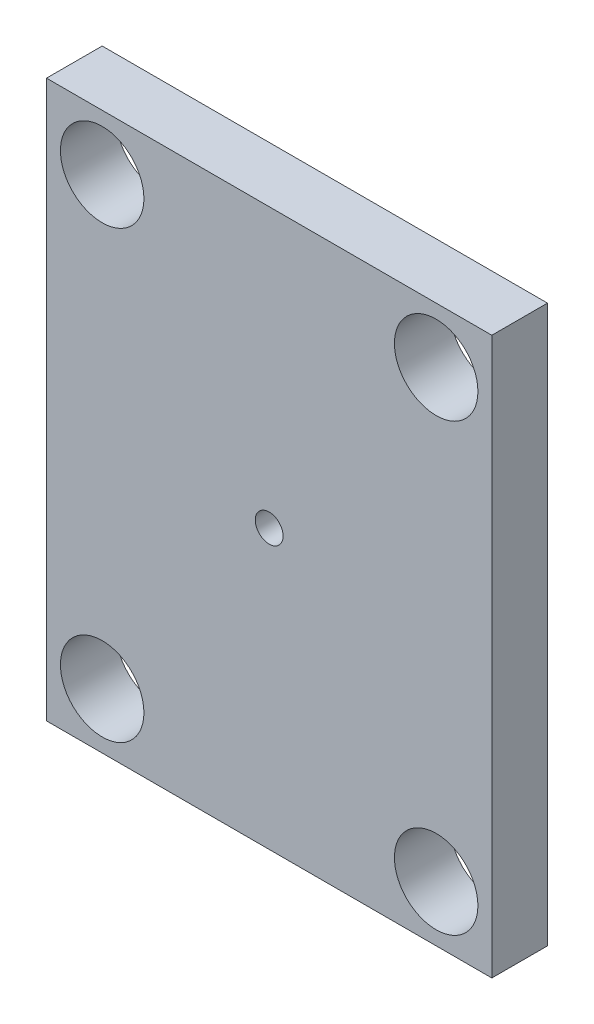
ISO-10303-21;
HEADER;
FILE_DESCRIPTION(('STEP AP214'),'2;1');
FILE_NAME('part.step','',(''),(''),'','','');
FILE_SCHEMA(('AUTOMOTIVE_DESIGN { 1 0 10303 214 1 1 1 1 }'));
ENDSEC;
DATA;
#1=APPLICATION_CONTEXT('core data for automotive mechanical design processes');
#2=APPLICATION_PROTOCOL_DEFINITION('international standard','automotive_design',2000,#1);
#3=PRODUCT_CONTEXT('',#1,'mechanical');
#4=PRODUCT('Part','Part','',(#3));
#5=PRODUCT_RELATED_PRODUCT_CATEGORY('part','',(#4));
#6=PRODUCT_DEFINITION_FORMATION('','',#4);
#7=PRODUCT_DEFINITION_CONTEXT('part definition',#1,'design');
#8=PRODUCT_DEFINITION('design','',#6,#7);
#9=PRODUCT_DEFINITION_SHAPE('','',#8);
#10=(LENGTH_UNIT() NAMED_UNIT(*) SI_UNIT(.MILLI.,.METRE.));
#11=(NAMED_UNIT(*) PLANE_ANGLE_UNIT() SI_UNIT($,.RADIAN.));
#12=(NAMED_UNIT(*) SI_UNIT($,.STERADIAN.) SOLID_ANGLE_UNIT());
#13=UNCERTAINTY_MEASURE_WITH_UNIT(LENGTH_MEASURE(1.E-05),#10,'distance_accuracy_value','');
#14=(GEOMETRIC_REPRESENTATION_CONTEXT(3) GLOBAL_UNCERTAINTY_ASSIGNED_CONTEXT((#13)) GLOBAL_UNIT_ASSIGNED_CONTEXT((#10,
#11,#12)) REPRESENTATION_CONTEXT('',''));
#15=CARTESIAN_POINT('',(0.,0.,0.));
#16=DIRECTION('',(0.,0.,1.));
#17=DIRECTION('',(1.,0.,0.));
#18=AXIS2_PLACEMENT_3D('',#15,#16,#17);
#19=CARTESIAN_POINT('',(0.,0.,19.05));
#20=DIRECTION('',(0.,1.,0.));
#21=DIRECTION('',(0.,0.,1.));
#22=AXIS2_PLACEMENT_3D('',#19,#20,#21);
#23=PLANE('',#22);
#24=DIRECTION('',(0.,0.,-1.));
#25=VECTOR('',#24,1.);
#26=CARTESIAN_POINT('',(0.,0.,19.05));
#27=LINE('',#26,#25);
#28=CARTESIAN_POINT('',(0.,0.,19.05));
#29=VERTEX_POINT('',#28);
#30=CARTESIAN_POINT('',(0.,0.,6.35));
#31=VERTEX_POINT('',#30);
#32=EDGE_CURVE('E11',#29,#31,#27,.T.);
#33=ORIENTED_EDGE('',*,*,#32,.T.);
#34=DIRECTION('',(-1.,0.,0.));
#35=VECTOR('',#34,1.);
#36=CARTESIAN_POINT('',(101.6,0.,6.35));
#37=LINE('',#36,#35);
#38=CARTESIAN_POINT('',(101.6,0.,6.35));
#39=VERTEX_POINT('',#38);
#40=EDGE_CURVE('E188',#39,#31,#37,.T.);
#41=ORIENTED_EDGE('',*,*,#40,.F.);
#42=DIRECTION('',(0.,0.,-1.));
#43=VECTOR('',#42,1.);
#44=CARTESIAN_POINT('',(101.6,0.,19.05));
#45=LINE('',#44,#43);
#46=CARTESIAN_POINT('',(101.6,0.,19.05));
#47=VERTEX_POINT('',#46);
#48=EDGE_CURVE('E50',#47,#39,#45,.T.);
#49=ORIENTED_EDGE('',*,*,#48,.F.);
#50=DIRECTION('',(1.,0.,0.));
#51=VECTOR('',#50,1.);
#52=CARTESIAN_POINT('',(0.,0.,19.05));
#53=LINE('',#52,#51);
#54=EDGE_CURVE('E142',#29,#47,#53,.T.);
#55=ORIENTED_EDGE('',*,*,#54,.F.);
#56=EDGE_LOOP('',(#33,#41,#49,#55));
#57=FACE_BOUND('',#56,.T.);
#58=ADVANCED_FACE('F41',(#57),#23,.F.);
#59=CARTESIAN_POINT('',(0.,127.,19.05));
#60=DIRECTION('',(0.,-1.,0.));
#61=DIRECTION('',(0.,0.,-1.));
#62=AXIS2_PLACEMENT_3D('',#59,#60,#61);
#63=PLANE('',#62);
#64=DIRECTION('',(1.,0.,0.));
#65=VECTOR('',#64,1.);
#66=CARTESIAN_POINT('',(101.6,127.,6.35));
#67=LINE('',#66,#65);
#68=CARTESIAN_POINT('',(0.,127.,6.35));
#69=VERTEX_POINT('',#68);
#70=CARTESIAN_POINT('',(101.6,127.,6.35));
#71=VERTEX_POINT('',#70);
#72=EDGE_CURVE('E143',#69,#71,#67,.T.);
#73=ORIENTED_EDGE('',*,*,#72,.F.);
#74=DIRECTION('',(0.,0.,-1.));
#75=VECTOR('',#74,1.);
#76=CARTESIAN_POINT('',(0.,127.,19.05));
#77=LINE('',#76,#75);
#78=CARTESIAN_POINT('',(0.,127.,19.05));
#79=VERTEX_POINT('',#78);
#80=EDGE_CURVE('E148',#79,#69,#77,.T.);
#81=ORIENTED_EDGE('',*,*,#80,.F.);
#82=DIRECTION('',(-1.,0.,0.));
#83=VECTOR('',#82,1.);
#84=CARTESIAN_POINT('',(0.,127.,19.05));
#85=LINE('',#84,#83);
#86=CARTESIAN_POINT('',(101.6,127.,19.05));
#87=VERTEX_POINT('',#86);
#88=EDGE_CURVE('E66',#87,#79,#85,.T.);
#89=ORIENTED_EDGE('',*,*,#88,.F.);
#90=DIRECTION('',(0.,0.,-1.));
#91=VECTOR('',#90,1.);
#92=CARTESIAN_POINT('',(101.6,127.,19.05));
#93=LINE('',#92,#91);
#94=EDGE_CURVE('E151',#87,#71,#93,.T.);
#95=ORIENTED_EDGE('',*,*,#94,.T.);
#96=EDGE_LOOP('',(#73,#81,#89,#95));
#97=FACE_BOUND('',#96,.T.);
#98=ADVANCED_FACE('F204',(#97),#63,.F.);
#99=CARTESIAN_POINT('',(0.,0.,19.05));
#100=DIRECTION('',(1.,0.,0.));
#101=DIRECTION('',(0.,0.,-1.));
#102=AXIS2_PLACEMENT_3D('',#99,#100,#101);
#103=PLANE('',#102);
#104=DIRECTION('',(0.,1.,0.));
#105=VECTOR('',#104,1.);
#106=CARTESIAN_POINT('',(0.,127.,6.35));
#107=LINE('',#106,#105);
#108=EDGE_CURVE('E134',#31,#69,#107,.T.);
#109=ORIENTED_EDGE('',*,*,#108,.F.);
#110=ORIENTED_EDGE('',*,*,#32,.F.);
#111=DIRECTION('',(0.,-1.,0.));
#112=VECTOR('',#111,1.);
#113=CARTESIAN_POINT('',(0.,0.,19.05));
#114=LINE('',#113,#112);
#115=EDGE_CURVE('E140',#79,#29,#114,.T.);
#116=ORIENTED_EDGE('',*,*,#115,.F.);
#117=ORIENTED_EDGE('',*,*,#80,.T.);
#118=EDGE_LOOP('',(#109,#110,#116,#117));
#119=FACE_BOUND('',#118,.T.);
#120=ADVANCED_FACE('F43',(#119),#103,.F.);
#121=CARTESIAN_POINT('',(101.6,0.,19.05));
#122=DIRECTION('',(-1.,0.,0.));
#123=DIRECTION('',(0.,0.,1.));
#124=AXIS2_PLACEMENT_3D('',#121,#122,#123);
#125=PLANE('',#124);
#126=DIRECTION('',(0.,-1.,0.));
#127=VECTOR('',#126,1.);
#128=CARTESIAN_POINT('',(101.6,127.,6.35));
#129=LINE('',#128,#127);
#130=EDGE_CURVE('E132',#71,#39,#129,.T.);
#131=ORIENTED_EDGE('',*,*,#130,.F.);
#132=ORIENTED_EDGE('',*,*,#94,.F.);
#133=DIRECTION('',(0.,1.,0.));
#134=VECTOR('',#133,1.);
#135=CARTESIAN_POINT('',(101.6,0.,19.05));
#136=LINE('',#135,#134);
#137=EDGE_CURVE('E145',#47,#87,#136,.T.);
#138=ORIENTED_EDGE('',*,*,#137,.F.);
#139=ORIENTED_EDGE('',*,*,#48,.T.);
#140=EDGE_LOOP('',(#131,#132,#138,#139));
#141=FACE_BOUND('',#140,.T.);
#142=ADVANCED_FACE('F201',(#141),#125,.F.);
#143=CARTESIAN_POINT('',(0.,0.,19.05));
#144=DIRECTION('',(0.,0.,-1.));
#145=DIRECTION('',(-1.,0.,0.));
#146=AXIS2_PLACEMENT_3D('',#143,#144,#145);
#147=PLANE('',#146);
#148=CARTESIAN_POINT('',(88.9,114.3,19.05));
#149=DIRECTION('',(0.,0.,1.));
#150=DIRECTION('',(1.,0.,0.));
#151=AXIS2_PLACEMENT_3D('',#148,#149,#150);
#152=CIRCLE('',#151,9.525);
#153=CARTESIAN_POINT('',(98.425,114.3,19.05));
#154=VERTEX_POINT('',#153);
#155=EDGE_CURVE('E270',#154,#154,#152,.T.);
#156=ORIENTED_EDGE('',*,*,#155,.F.);
#157=EDGE_LOOP('',(#156));
#158=FACE_BOUND('',#157,.T.);
#159=CARTESIAN_POINT('',(12.7,12.7,19.05));
#160=DIRECTION('',(0.,0.,1.));
#161=DIRECTION('',(1.,0.,0.));
#162=AXIS2_PLACEMENT_3D('',#159,#160,#161);
#163=CIRCLE('',#162,9.52500000000001);
#164=CARTESIAN_POINT('',(22.225,12.7,19.05));
#165=VERTEX_POINT('',#164);
#166=EDGE_CURVE('E267',#165,#165,#163,.T.);
#167=ORIENTED_EDGE('',*,*,#166,.F.);
#168=EDGE_LOOP('',(#167));
#169=FACE_BOUND('',#168,.T.);
#170=CARTESIAN_POINT('',(88.9,12.7,19.05));
#171=DIRECTION('',(0.,0.,1.));
#172=DIRECTION('',(1.,0.,0.));
#173=AXIS2_PLACEMENT_3D('',#170,#171,#172);
#174=CIRCLE('',#173,9.52499999999999);
#175=CARTESIAN_POINT('',(98.425,12.7,19.05));
#176=VERTEX_POINT('',#175);
#177=EDGE_CURVE('E265',#176,#176,#174,.T.);
#178=ORIENTED_EDGE('',*,*,#177,.F.);
#179=EDGE_LOOP('',(#178));
#180=FACE_BOUND('',#179,.T.);
#181=CARTESIAN_POINT('',(12.7,114.3,19.05));
#182=DIRECTION('',(0.,0.,1.));
#183=DIRECTION('',(1.,0.,0.));
#184=AXIS2_PLACEMENT_3D('',#181,#182,#183);
#185=CIRCLE('',#184,9.52500000000001);
#186=CARTESIAN_POINT('',(22.225,114.3,19.05));
#187=VERTEX_POINT('',#186);
#188=EDGE_CURVE('E160',#187,#187,#185,.T.);
#189=ORIENTED_EDGE('',*,*,#188,.F.);
#190=EDGE_LOOP('',(#189));
#191=FACE_BOUND('',#190,.T.);
#192=CARTESIAN_POINT('',(50.8,63.5,19.05));
#193=DIRECTION('',(0.,0.,1.));
#194=DIRECTION('',(1.,0.,0.));
#195=AXIS2_PLACEMENT_3D('',#192,#193,#194);
#196=CIRCLE('',#195,3.175);
#197=CARTESIAN_POINT('',(53.975,63.5,19.05));
#198=VERTEX_POINT('',#197);
#199=EDGE_CURVE('E167',#198,#198,#196,.T.);
#200=ORIENTED_EDGE('',*,*,#199,.F.);
#201=EDGE_LOOP('',(#200));
#202=FACE_BOUND('',#201,.T.);
#203=ORIENTED_EDGE('',*,*,#115,.T.);
#204=ORIENTED_EDGE('',*,*,#54,.T.);
#205=ORIENTED_EDGE('',*,*,#137,.T.);
#206=ORIENTED_EDGE('',*,*,#88,.T.);
#207=EDGE_LOOP('',(#203,#204,#205,#206));
#208=FACE_BOUND('',#207,.T.);
#209=ADVANCED_FACE('F208',(#158,#169,#180,#191,#202,#208),#147,.F.);
#210=CARTESIAN_POINT('',(0.,0.,0.));
#211=DIRECTION('',(0.,0.,-1.));
#212=DIRECTION('',(-1.,0.,0.));
#213=AXIS2_PLACEMENT_3D('',#210,#211,#212);
#214=PLANE('',#213);
#215=DIRECTION('',(1.,0.,0.));
#216=VECTOR('',#215,1.);
#217=CARTESIAN_POINT('',(76.2,50.8,0.));
#218=LINE('',#217,#216);
#219=CARTESIAN_POINT('',(25.4,50.8,0.));
#220=VERTEX_POINT('',#219);
#221=CARTESIAN_POINT('',(76.2,50.8,0.));
#222=VERTEX_POINT('',#221);
#223=EDGE_CURVE('E110',#220,#222,#218,.T.);
#224=ORIENTED_EDGE('',*,*,#223,.F.);
#225=DIRECTION('',(0.,-1.,0.));
#226=VECTOR('',#225,1.);
#227=CARTESIAN_POINT('',(25.4,127.,0.));
#228=LINE('',#227,#226);
#229=CARTESIAN_POINT('',(25.4,76.2,0.));
#230=VERTEX_POINT('',#229);
#231=EDGE_CURVE('E122',#230,#220,#228,.T.);
#232=ORIENTED_EDGE('',*,*,#231,.F.);
#233=DIRECTION('',(-1.,0.,0.));
#234=VECTOR('',#233,1.);
#235=CARTESIAN_POINT('',(76.2,76.2,0.));
#236=LINE('',#235,#234);
#237=CARTESIAN_POINT('',(76.2,76.2,0.));
#238=VERTEX_POINT('',#237);
#239=EDGE_CURVE('E125',#238,#230,#236,.T.);
#240=ORIENTED_EDGE('',*,*,#239,.F.);
#241=DIRECTION('',(0.,1.,0.));
#242=VECTOR('',#241,1.);
#243=CARTESIAN_POINT('',(76.2,127.,0.));
#244=LINE('',#243,#242);
#245=EDGE_CURVE('E124',#222,#238,#244,.T.);
#246=ORIENTED_EDGE('',*,*,#245,.F.);
#247=EDGE_LOOP('',(#224,#232,#240,#246));
#248=FACE_BOUND('',#247,.T.);
#249=ADVANCED_FACE('F120',(#248),#214,.T.);
#250=CARTESIAN_POINT('',(25.4,127.,6.35));
#251=DIRECTION('',(1.,0.,0.));
#252=DIRECTION('',(0.,1.,0.));
#253=AXIS2_PLACEMENT_3D('',#250,#251,#252);
#254=PLANE('',#253);
#255=ORIENTED_EDGE('',*,*,#231,.T.);
#256=DIRECTION('',(0.,0.,-1.));
#257=VECTOR('',#256,1.);
#258=CARTESIAN_POINT('',(25.4,50.8,78.1920489685532));
#259=LINE('',#258,#257);
#260=CARTESIAN_POINT('',(25.4,50.8,6.34999999999999));
#261=VERTEX_POINT('',#260);
#262=EDGE_CURVE('E107',#261,#220,#259,.T.);
#263=ORIENTED_EDGE('',*,*,#262,.F.);
#264=DIRECTION('',(0.,-1.,0.));
#265=VECTOR('',#264,1.);
#266=CARTESIAN_POINT('',(25.4,127.,6.35));
#267=LINE('',#266,#265);
#268=CARTESIAN_POINT('',(25.4,76.2,6.34999999999999));
#269=VERTEX_POINT('',#268);
#270=EDGE_CURVE('E130',#269,#261,#267,.T.);
#271=ORIENTED_EDGE('',*,*,#270,.F.);
#272=DIRECTION('',(0.,0.,-1.));
#273=VECTOR('',#272,1.);
#274=CARTESIAN_POINT('',(25.4,76.2,78.1920489685532));
#275=LINE('',#274,#273);
#276=EDGE_CURVE('E129',#269,#230,#275,.T.);
#277=ORIENTED_EDGE('',*,*,#276,.T.);
#278=EDGE_LOOP('',(#255,#263,#271,#277));
#279=FACE_BOUND('',#278,.T.);
#280=ADVANCED_FACE('F128',(#279),#254,.F.);
#281=CARTESIAN_POINT('',(76.2,127.,6.35));
#282=DIRECTION('',(-1.,0.,0.));
#283=DIRECTION('',(0.,0.,1.));
#284=AXIS2_PLACEMENT_3D('',#281,#282,#283);
#285=PLANE('',#284);
#286=DIRECTION('',(0.,1.,0.));
#287=VECTOR('',#286,1.);
#288=CARTESIAN_POINT('',(76.2,127.,6.35));
#289=LINE('',#288,#287);
#290=CARTESIAN_POINT('',(76.2,50.8,6.35));
#291=VERTEX_POINT('',#290);
#292=CARTESIAN_POINT('',(76.2,76.2,6.34999999999999));
#293=VERTEX_POINT('',#292);
#294=EDGE_CURVE('E190',#291,#293,#289,.T.);
#295=ORIENTED_EDGE('',*,*,#294,.F.);
#296=DIRECTION('',(0.,0.,-1.));
#297=VECTOR('',#296,1.);
#298=CARTESIAN_POINT('',(76.2,50.8,78.1920489685532));
#299=LINE('',#298,#297);
#300=EDGE_CURVE('E58',#291,#222,#299,.T.);
#301=ORIENTED_EDGE('',*,*,#300,.T.);
#302=ORIENTED_EDGE('',*,*,#245,.T.);
#303=DIRECTION('',(0.,0.,-1.));
#304=VECTOR('',#303,1.);
#305=CARTESIAN_POINT('',(76.2,76.2,78.1920489685532));
#306=LINE('',#305,#304);
#307=EDGE_CURVE('E183',#293,#238,#306,.T.);
#308=ORIENTED_EDGE('',*,*,#307,.F.);
#309=EDGE_LOOP('',(#295,#301,#302,#308));
#310=FACE_BOUND('',#309,.T.);
#311=ADVANCED_FACE('F225',(#310),#285,.F.);
#312=CARTESIAN_POINT('',(0.,0.,6.35));
#313=DIRECTION('',(0.,0.,-1.));
#314=DIRECTION('',(-1.,0.,0.));
#315=AXIS2_PLACEMENT_3D('',#312,#313,#314);
#316=PLANE('',#315);
#317=CARTESIAN_POINT('',(88.9,114.3,6.35));
#318=DIRECTION('',(0.,0.,-1.));
#319=DIRECTION('',(-1.,0.,0.));
#320=AXIS2_PLACEMENT_3D('',#317,#318,#319);
#321=CIRCLE('',#320,9.525);
#322=CARTESIAN_POINT('',(98.425,114.3,6.35));
#323=VERTEX_POINT('',#322);
#324=EDGE_CURVE('E45',#323,#323,#321,.T.);
#325=ORIENTED_EDGE('',*,*,#324,.F.);
#326=EDGE_LOOP('',(#325));
#327=FACE_BOUND('',#326,.T.);
#328=CARTESIAN_POINT('',(12.7,12.7,6.35));
#329=DIRECTION('',(0.,0.,-1.));
#330=DIRECTION('',(-1.,0.,0.));
#331=AXIS2_PLACEMENT_3D('',#328,#329,#330);
#332=CIRCLE('',#331,9.52500000000001);
#333=CARTESIAN_POINT('',(22.225,12.7,6.35));
#334=VERTEX_POINT('',#333);
#335=EDGE_CURVE('E162',#334,#334,#332,.T.);
#336=ORIENTED_EDGE('',*,*,#335,.F.);
#337=EDGE_LOOP('',(#336));
#338=FACE_BOUND('',#337,.T.);
#339=CARTESIAN_POINT('',(88.9,12.7,6.35));
#340=DIRECTION('',(0.,0.,-1.));
#341=DIRECTION('',(-1.,0.,0.));
#342=AXIS2_PLACEMENT_3D('',#339,#340,#341);
#343=CIRCLE('',#342,9.52499999999999);
#344=CARTESIAN_POINT('',(98.425,12.7,6.35));
#345=VERTEX_POINT('',#344);
#346=EDGE_CURVE('E159',#345,#345,#343,.T.);
#347=ORIENTED_EDGE('',*,*,#346,.F.);
#348=EDGE_LOOP('',(#347));
#349=FACE_BOUND('',#348,.T.);
#350=CARTESIAN_POINT('',(12.7,114.3,6.35));
#351=DIRECTION('',(0.,0.,-1.));
#352=DIRECTION('',(-1.,0.,0.));
#353=AXIS2_PLACEMENT_3D('',#350,#351,#352);
#354=CIRCLE('',#353,9.52500000000001);
#355=CARTESIAN_POINT('',(22.225,114.3,6.35));
#356=VERTEX_POINT('',#355);
#357=EDGE_CURVE('E156',#356,#356,#354,.T.);
#358=ORIENTED_EDGE('',*,*,#357,.F.);
#359=EDGE_LOOP('',(#358));
#360=FACE_BOUND('',#359,.T.);
#361=ORIENTED_EDGE('',*,*,#40,.T.);
#362=ORIENTED_EDGE('',*,*,#108,.T.);
#363=ORIENTED_EDGE('',*,*,#72,.T.);
#364=ORIENTED_EDGE('',*,*,#130,.T.);
#365=EDGE_LOOP('',(#361,#362,#363,#364));
#366=FACE_BOUND('',#365,.T.);
#367=ORIENTED_EDGE('',*,*,#270,.T.);
#368=DIRECTION('',(-1.,0.,0.));
#369=VECTOR('',#368,1.);
#370=CARTESIAN_POINT('',(76.2,50.8,6.34999999999999));
#371=LINE('',#370,#369);
#372=EDGE_CURVE('E111',#291,#261,#371,.T.);
#373=ORIENTED_EDGE('',*,*,#372,.F.);
#374=ORIENTED_EDGE('',*,*,#294,.T.);
#375=DIRECTION('',(1.,0.,0.));
#376=VECTOR('',#375,1.);
#377=CARTESIAN_POINT('',(76.2,76.2,6.34999999999999));
#378=LINE('',#377,#376);
#379=EDGE_CURVE('E176',#269,#293,#378,.T.);
#380=ORIENTED_EDGE('',*,*,#379,.F.);
#381=EDGE_LOOP('',(#367,#373,#374,#380));
#382=FACE_BOUND('',#381,.T.);
#383=ADVANCED_FACE('F194',(#327,#338,#349,#360,#366,#382),#316,.T.);
#384=CARTESIAN_POINT('',(76.2,76.2,78.1920489685532));
#385=DIRECTION('',(0.,-1.,0.));
#386=DIRECTION('',(0.,0.,-1.));
#387=AXIS2_PLACEMENT_3D('',#384,#385,#386);
#388=PLANE('',#387);
#389=ORIENTED_EDGE('',*,*,#379,.T.);
#390=ORIENTED_EDGE('',*,*,#307,.T.);
#391=ORIENTED_EDGE('',*,*,#239,.T.);
#392=ORIENTED_EDGE('',*,*,#276,.F.);
#393=EDGE_LOOP('',(#389,#390,#391,#392));
#394=FACE_BOUND('',#393,.T.);
#395=ADVANCED_FACE('F231',(#394),#388,.F.);
#396=CARTESIAN_POINT('',(76.2,50.8,78.1920489685532));
#397=DIRECTION('',(0.,1.,0.));
#398=DIRECTION('',(0.,0.,1.));
#399=AXIS2_PLACEMENT_3D('',#396,#397,#398);
#400=PLANE('',#399);
#401=ORIENTED_EDGE('',*,*,#372,.T.);
#402=ORIENTED_EDGE('',*,*,#262,.T.);
#403=ORIENTED_EDGE('',*,*,#223,.T.);
#404=ORIENTED_EDGE('',*,*,#300,.F.);
#405=EDGE_LOOP('',(#401,#402,#403,#404));
#406=FACE_BOUND('',#405,.T.);
#407=ADVANCED_FACE('F109',(#406),#400,.F.);
#408=CARTESIAN_POINT('',(50.8,63.5,9.525));
#409=DIRECTION('',(0.,0.,1.));
#410=DIRECTION('',(1.,0.,0.));
#411=AXIS2_PLACEMENT_3D('',#408,#409,#410);
#412=CYLINDRICAL_SURFACE('',#411,3.175);
#413=CARTESIAN_POINT('',(50.8,63.5,9.525));
#414=DIRECTION('',(0.,0.,1.));
#415=DIRECTION('',(1.,0.,0.));
#416=AXIS2_PLACEMENT_3D('',#413,#414,#415);
#417=CIRCLE('',#416,3.175);
#418=CARTESIAN_POINT('',(53.975,63.5,9.525));
#419=VERTEX_POINT('',#418);
#420=EDGE_CURVE('E171',#419,#419,#417,.T.);
#421=CARTESIAN_POINT('',(53.975,63.5,9.525));
#422=CARTESIAN_POINT('',(53.975,63.5,9.62421875));
#423=CARTESIAN_POINT('',(53.975,63.5,9.7234375));
#424=CARTESIAN_POINT('',(53.975,63.5,9.921875));
#425=CARTESIAN_POINT('',(53.975,63.5,10.02109375));
#426=CARTESIAN_POINT('',(53.975,63.5,10.21953125));
#427=CARTESIAN_POINT('',(53.975,63.5,10.31875));
#428=CARTESIAN_POINT('',(53.975,63.5,10.5171875));
#429=CARTESIAN_POINT('',(53.975,63.5,10.61640625));
#430=CARTESIAN_POINT('',(53.975,63.5,10.81484375));
#431=CARTESIAN_POINT('',(53.975,63.5,10.9140625));
#432=CARTESIAN_POINT('',(53.975,63.5,11.1125));
#433=CARTESIAN_POINT('',(53.975,63.5,11.21171875));
#434=CARTESIAN_POINT('',(53.975,63.5,11.41015625));
#435=CARTESIAN_POINT('',(53.975,63.5,11.509375));
#436=CARTESIAN_POINT('',(53.975,63.5,11.7078125));
#437=CARTESIAN_POINT('',(53.975,63.5,11.80703125));
#438=CARTESIAN_POINT('',(53.975,63.5,12.00546875));
#439=CARTESIAN_POINT('',(53.975,63.5,12.1046875));
#440=CARTESIAN_POINT('',(53.975,63.5,12.303125));
#441=CARTESIAN_POINT('',(53.975,63.5,12.40234375));
#442=CARTESIAN_POINT('',(53.975,63.5,12.60078125));
#443=CARTESIAN_POINT('',(53.975,63.5,12.7));
#444=CARTESIAN_POINT('',(53.975,63.5,12.8984375));
#445=CARTESIAN_POINT('',(53.975,63.5,12.99765625));
#446=CARTESIAN_POINT('',(53.975,63.5,13.19609375));
#447=CARTESIAN_POINT('',(53.975,63.5,13.2953125));
#448=CARTESIAN_POINT('',(53.975,63.5,13.49375));
#449=CARTESIAN_POINT('',(53.975,63.5,13.59296875));
#450=CARTESIAN_POINT('',(53.975,63.5,13.79140625));
#451=CARTESIAN_POINT('',(53.975,63.5,13.890625));
#452=CARTESIAN_POINT('',(53.975,63.5,14.0890625));
#453=CARTESIAN_POINT('',(53.975,63.5,14.18828125));
#454=CARTESIAN_POINT('',(53.975,63.5,14.38671875));
#455=CARTESIAN_POINT('',(53.975,63.5,14.4859375));
#456=CARTESIAN_POINT('',(53.975,63.5,14.684375));
#457=CARTESIAN_POINT('',(53.975,63.5,14.78359375));
#458=CARTESIAN_POINT('',(53.975,63.5,14.98203125));
#459=CARTESIAN_POINT('',(53.975,63.5,15.08125));
#460=CARTESIAN_POINT('',(53.975,63.5,15.2796875));
#461=CARTESIAN_POINT('',(53.975,63.5,15.37890625));
#462=CARTESIAN_POINT('',(53.975,63.5,15.57734375));
#463=CARTESIAN_POINT('',(53.975,63.5,15.6765625));
#464=CARTESIAN_POINT('',(53.975,63.5,15.875));
#465=CARTESIAN_POINT('',(53.975,63.5,15.97421875));
#466=CARTESIAN_POINT('',(53.975,63.5,16.17265625));
#467=CARTESIAN_POINT('',(53.975,63.5,16.271875));
#468=CARTESIAN_POINT('',(53.975,63.5,16.4703125));
#469=CARTESIAN_POINT('',(53.975,63.5,16.56953125));
#470=CARTESIAN_POINT('',(53.975,63.5,16.76796875));
#471=CARTESIAN_POINT('',(53.975,63.5,16.8671875));
#472=CARTESIAN_POINT('',(53.975,63.5,17.065625));
#473=CARTESIAN_POINT('',(53.975,63.5,17.16484375));
#474=CARTESIAN_POINT('',(53.975,63.5,17.36328125));
#475=CARTESIAN_POINT('',(53.975,63.5,17.4625));
#476=CARTESIAN_POINT('',(53.975,63.5,17.6609375));
#477=CARTESIAN_POINT('',(53.975,63.5,17.76015625));
#478=CARTESIAN_POINT('',(53.975,63.5,17.95859375));
#479=CARTESIAN_POINT('',(53.975,63.5,18.0578125));
#480=CARTESIAN_POINT('',(53.975,63.5,18.25625));
#481=CARTESIAN_POINT('',(53.975,63.5,18.35546875));
#482=CARTESIAN_POINT('',(53.975,63.5,18.55390625));
#483=CARTESIAN_POINT('',(53.975,63.5,18.653125));
#484=CARTESIAN_POINT('',(53.975,63.5,18.8515625));
#485=CARTESIAN_POINT('',(53.975,63.5,18.95078125));
#486=CARTESIAN_POINT('',(53.975,63.5,19.05));
#487=B_SPLINE_CURVE_WITH_KNOTS('',3,(#421,#422,#423,#424,#425,#426,#427,#428,#429,#430,#431,
#432,#433,#434,#435,#436,#437,#438,#439,#440,#441,#442,#443,#444,#445,#446,#447,#448,#449,#450,
#451,#452,#453,#454,#455,#456,#457,#458,#459,#460,#461,#462,#463,#464,#465,#466,#467,#468,#469,
#470,#471,#472,#473,#474,#475,#476,#477,#478,#479,#480,#481,#482,#483,#484,#485,#486),
.UNSPECIFIED.,.F.,.F.,(4,2,2,2,2,2,2,2,2,2,2,2,2,2,2,2,2,2,2,2,2,2,2,2,2,2,2,2,2,2,2,2,4),(0.,
0.297656249999998,0.595312499999999,0.892968749999999,1.190625,1.48828125,1.7859375,2.08359375,
2.38125,2.67890625,2.9765625,3.27421875,3.571875,3.86953125,4.1671875,4.46484375,4.7625,
5.06015625,5.3578125,5.65546875,5.953125,6.25078125,6.5484375,6.84609375,7.14375,7.44140625,
7.7390625,8.03671875,8.334375,8.63203125,8.9296875,9.22734375,9.525),.UNSPECIFIED.);
#488=EDGE_CURVE('BSEAM238',#419,#198,#487,.T.);
#489=ORIENTED_EDGE('',*,*,#420,.F.);
#490=ORIENTED_EDGE('',*,*,#199,.T.);
#491=ORIENTED_EDGE('',*,*,#488,.T.);
#492=ORIENTED_EDGE('',*,*,#488,.F.);
#493=EDGE_LOOP('',(#489,#491,#490,#492));
#494=FACE_BOUND('',#493,.T.);
#495=ADVANCED_FACE('F238',(#494),#412,.F.);
#496=CARTESIAN_POINT('',(50.8,63.5,9.525));
#497=DIRECTION('',(0.,0.,1.));
#498=DIRECTION('',(1.,0.,0.));
#499=AXIS2_PLACEMENT_3D('',#496,#497,#498);
#500=PLANE('',#499);
#501=ORIENTED_EDGE('',*,*,#420,.T.);
#502=EDGE_LOOP('',(#501));
#503=FACE_BOUND('',#502,.T.);
#504=ADVANCED_FACE('F241',(#503),#500,.T.);
#505=CARTESIAN_POINT('',(12.7,114.3,0.));
#506=DIRECTION('',(0.,0.,1.));
#507=DIRECTION('',(1.,0.,0.));
#508=AXIS2_PLACEMENT_3D('',#505,#506,#507);
#509=CYLINDRICAL_SURFACE('',#508,9.52500000000001);
#510=CARTESIAN_POINT('',(22.225,114.3,6.35));
#511=CARTESIAN_POINT('',(22.225,114.3,6.48229166666667));
#512=CARTESIAN_POINT('',(22.225,114.3,6.61458333333333));
#513=CARTESIAN_POINT('',(22.225,114.3,6.87916666666667));
#514=CARTESIAN_POINT('',(22.225,114.3,7.01145833333333));
#515=CARTESIAN_POINT('',(22.225,114.3,7.27604166666667));
#516=CARTESIAN_POINT('',(22.225,114.3,7.40833333333333));
#517=CARTESIAN_POINT('',(22.225,114.3,7.67291666666667));
#518=CARTESIAN_POINT('',(22.225,114.3,7.80520833333333));
#519=CARTESIAN_POINT('',(22.225,114.3,8.06979166666667));
#520=CARTESIAN_POINT('',(22.225,114.3,8.20208333333333));
#521=CARTESIAN_POINT('',(22.225,114.3,8.46666666666667));
#522=CARTESIAN_POINT('',(22.225,114.3,8.59895833333333));
#523=CARTESIAN_POINT('',(22.225,114.3,8.86354166666667));
#524=CARTESIAN_POINT('',(22.225,114.3,8.99583333333334));
#525=CARTESIAN_POINT('',(22.225,114.3,9.26041666666667));
#526=CARTESIAN_POINT('',(22.225,114.3,9.39270833333333));
#527=CARTESIAN_POINT('',(22.225,114.3,9.65729166666667));
#528=CARTESIAN_POINT('',(22.225,114.3,9.78958333333333));
#529=CARTESIAN_POINT('',(22.225,114.3,10.0541666666667));
#530=CARTESIAN_POINT('',(22.225,114.3,10.1864583333333));
#531=CARTESIAN_POINT('',(22.225,114.3,10.4510416666667));
#532=CARTESIAN_POINT('',(22.225,114.3,10.5833333333333));
#533=CARTESIAN_POINT('',(22.225,114.3,10.8479166666667));
#534=CARTESIAN_POINT('',(22.225,114.3,10.9802083333333));
#535=CARTESIAN_POINT('',(22.225,114.3,11.2447916666667));
#536=CARTESIAN_POINT('',(22.225,114.3,11.3770833333333));
#537=CARTESIAN_POINT('',(22.225,114.3,11.6416666666667));
#538=CARTESIAN_POINT('',(22.225,114.3,11.7739583333333));
#539=CARTESIAN_POINT('',(22.225,114.3,12.0385416666667));
#540=CARTESIAN_POINT('',(22.225,114.3,12.1708333333333));
#541=CARTESIAN_POINT('',(22.225,114.3,12.4354166666667));
#542=CARTESIAN_POINT('',(22.225,114.3,12.5677083333333));
#543=CARTESIAN_POINT('',(22.225,114.3,12.8322916666667));
#544=CARTESIAN_POINT('',(22.225,114.3,12.9645833333333));
#545=CARTESIAN_POINT('',(22.225,114.3,13.2291666666667));
#546=CARTESIAN_POINT('',(22.225,114.3,13.3614583333333));
#547=CARTESIAN_POINT('',(22.225,114.3,13.6260416666667));
#548=CARTESIAN_POINT('',(22.225,114.3,13.7583333333333));
#549=CARTESIAN_POINT('',(22.225,114.3,14.0229166666667));
#550=CARTESIAN_POINT('',(22.225,114.3,14.1552083333333));
#551=CARTESIAN_POINT('',(22.225,114.3,14.4197916666667));
#552=CARTESIAN_POINT('',(22.225,114.3,14.5520833333333));
#553=CARTESIAN_POINT('',(22.225,114.3,14.8166666666667));
#554=CARTESIAN_POINT('',(22.225,114.3,14.9489583333333));
#555=CARTESIAN_POINT('',(22.225,114.3,15.2135416666667));
#556=CARTESIAN_POINT('',(22.225,114.3,15.3458333333333));
#557=CARTESIAN_POINT('',(22.225,114.3,15.6104166666667));
#558=CARTESIAN_POINT('',(22.225,114.3,15.7427083333333));
#559=CARTESIAN_POINT('',(22.225,114.3,16.0072916666667));
#560=CARTESIAN_POINT('',(22.225,114.3,16.1395833333333));
#561=CARTESIAN_POINT('',(22.225,114.3,16.4041666666667));
#562=CARTESIAN_POINT('',(22.225,114.3,16.5364583333333));
#563=CARTESIAN_POINT('',(22.225,114.3,16.8010416666667));
#564=CARTESIAN_POINT('',(22.225,114.3,16.9333333333333));
#565=CARTESIAN_POINT('',(22.225,114.3,17.1979166666667));
#566=CARTESIAN_POINT('',(22.225,114.3,17.3302083333333));
#567=CARTESIAN_POINT('',(22.225,114.3,17.5947916666667));
#568=CARTESIAN_POINT('',(22.225,114.3,17.7270833333333));
#569=CARTESIAN_POINT('',(22.225,114.3,17.9916666666667));
#570=CARTESIAN_POINT('',(22.225,114.3,18.1239583333333));
#571=CARTESIAN_POINT('',(22.225,114.3,18.3885416666667));
#572=CARTESIAN_POINT('',(22.225,114.3,18.5208333333333));
#573=CARTESIAN_POINT('',(22.225,114.3,18.7854166666667));
#574=CARTESIAN_POINT('',(22.225,114.3,18.9177083333333));
#575=CARTESIAN_POINT('',(22.225,114.3,19.05));
#576=B_SPLINE_CURVE_WITH_KNOTS('',3,(#510,#511,#512,#513,#514,#515,#516,#517,#518,#519,#520,
#521,#522,#523,#524,#525,#526,#527,#528,#529,#530,#531,#532,#533,#534,#535,#536,#537,#538,#539,
#540,#541,#542,#543,#544,#545,#546,#547,#548,#549,#550,#551,#552,#553,#554,#555,#556,#557,#558,
#559,#560,#561,#562,#563,#564,#565,#566,#567,#568,#569,#570,#571,#572,#573,#574,#575),
.UNSPECIFIED.,.F.,.F.,(4,2,2,2,2,2,2,2,2,2,2,2,2,2,2,2,2,2,2,2,2,2,2,2,2,2,2,2,2,2,2,2,4),(0.,
0.396875,0.79375,1.190625,1.5875,1.984375,2.38125,2.778125,3.175,3.571875,3.96875,4.365625,
4.7625,5.159375,5.55625,5.953125,6.35,6.746875,7.14375,7.540625,7.9375,8.334375,8.73125,
9.128125,9.525,9.921875,10.31875,10.715625,11.1125,11.509375,11.90625,12.303125,12.7),.UNSPECIFIED.);
#577=EDGE_CURVE('BSEAM245',#356,#187,#576,.T.);
#578=ORIENTED_EDGE('',*,*,#357,.T.);
#579=ORIENTED_EDGE('',*,*,#188,.T.);
#580=ORIENTED_EDGE('',*,*,#577,.T.);
#581=ORIENTED_EDGE('',*,*,#577,.F.);
#582=EDGE_LOOP('',(#578,#580,#579,#581));
#583=FACE_BOUND('',#582,.T.);
#584=ADVANCED_FACE('F245',(#583),#509,.F.);
#585=CARTESIAN_POINT('',(88.9,12.7,0.));
#586=DIRECTION('',(0.,0.,1.));
#587=DIRECTION('',(1.,0.,0.));
#588=AXIS2_PLACEMENT_3D('',#585,#586,#587);
#589=CYLINDRICAL_SURFACE('',#588,9.52499999999999);
#590=CARTESIAN_POINT('',(98.425,12.7,6.35));
#591=CARTESIAN_POINT('',(98.425,12.7,6.48229166666667));
#592=CARTESIAN_POINT('',(98.425,12.7,6.61458333333333));
#593=CARTESIAN_POINT('',(98.425,12.7,6.87916666666667));
#594=CARTESIAN_POINT('',(98.425,12.7,7.01145833333333));
#595=CARTESIAN_POINT('',(98.425,12.7,7.27604166666667));
#596=CARTESIAN_POINT('',(98.425,12.7,7.40833333333333));
#597=CARTESIAN_POINT('',(98.425,12.7,7.67291666666667));
#598=CARTESIAN_POINT('',(98.425,12.7,7.80520833333333));
#599=CARTESIAN_POINT('',(98.425,12.7,8.06979166666667));
#600=CARTESIAN_POINT('',(98.425,12.7,8.20208333333333));
#601=CARTESIAN_POINT('',(98.425,12.7,8.46666666666667));
#602=CARTESIAN_POINT('',(98.425,12.7,8.59895833333333));
#603=CARTESIAN_POINT('',(98.425,12.7,8.86354166666667));
#604=CARTESIAN_POINT('',(98.425,12.7,8.99583333333334));
#605=CARTESIAN_POINT('',(98.425,12.7,9.26041666666667));
#606=CARTESIAN_POINT('',(98.425,12.7,9.39270833333333));
#607=CARTESIAN_POINT('',(98.425,12.7,9.65729166666667));
#608=CARTESIAN_POINT('',(98.425,12.7,9.78958333333333));
#609=CARTESIAN_POINT('',(98.425,12.7,10.0541666666667));
#610=CARTESIAN_POINT('',(98.425,12.7,10.1864583333333));
#611=CARTESIAN_POINT('',(98.425,12.7,10.4510416666667));
#612=CARTESIAN_POINT('',(98.425,12.7,10.5833333333333));
#613=CARTESIAN_POINT('',(98.425,12.7,10.8479166666667));
#614=CARTESIAN_POINT('',(98.425,12.7,10.9802083333333));
#615=CARTESIAN_POINT('',(98.425,12.7,11.2447916666667));
#616=CARTESIAN_POINT('',(98.425,12.7,11.3770833333333));
#617=CARTESIAN_POINT('',(98.425,12.7,11.6416666666667));
#618=CARTESIAN_POINT('',(98.425,12.7,11.7739583333333));
#619=CARTESIAN_POINT('',(98.425,12.7,12.0385416666667));
#620=CARTESIAN_POINT('',(98.425,12.7,12.1708333333333));
#621=CARTESIAN_POINT('',(98.425,12.7,12.4354166666667));
#622=CARTESIAN_POINT('',(98.425,12.7,12.5677083333333));
#623=CARTESIAN_POINT('',(98.425,12.7,12.8322916666667));
#624=CARTESIAN_POINT('',(98.425,12.7,12.9645833333333));
#625=CARTESIAN_POINT('',(98.425,12.7,13.2291666666667));
#626=CARTESIAN_POINT('',(98.425,12.7,13.3614583333333));
#627=CARTESIAN_POINT('',(98.425,12.7,13.6260416666667));
#628=CARTESIAN_POINT('',(98.425,12.7,13.7583333333333));
#629=CARTESIAN_POINT('',(98.425,12.7,14.0229166666667));
#630=CARTESIAN_POINT('',(98.425,12.7,14.1552083333333));
#631=CARTESIAN_POINT('',(98.425,12.7,14.4197916666667));
#632=CARTESIAN_POINT('',(98.425,12.7,14.5520833333333));
#633=CARTESIAN_POINT('',(98.425,12.7,14.8166666666667));
#634=CARTESIAN_POINT('',(98.425,12.7,14.9489583333333));
#635=CARTESIAN_POINT('',(98.425,12.7,15.2135416666667));
#636=CARTESIAN_POINT('',(98.425,12.7,15.3458333333333));
#637=CARTESIAN_POINT('',(98.425,12.7,15.6104166666667));
#638=CARTESIAN_POINT('',(98.425,12.7,15.7427083333333));
#639=CARTESIAN_POINT('',(98.425,12.7,16.0072916666667));
#640=CARTESIAN_POINT('',(98.425,12.7,16.1395833333333));
#641=CARTESIAN_POINT('',(98.425,12.7,16.4041666666667));
#642=CARTESIAN_POINT('',(98.425,12.7,16.5364583333333));
#643=CARTESIAN_POINT('',(98.425,12.7,16.8010416666667));
#644=CARTESIAN_POINT('',(98.425,12.7,16.9333333333333));
#645=CARTESIAN_POINT('',(98.425,12.7,17.1979166666667));
#646=CARTESIAN_POINT('',(98.425,12.7,17.3302083333333));
#647=CARTESIAN_POINT('',(98.425,12.7,17.5947916666667));
#648=CARTESIAN_POINT('',(98.425,12.7,17.7270833333333));
#649=CARTESIAN_POINT('',(98.425,12.7,17.9916666666667));
#650=CARTESIAN_POINT('',(98.425,12.7,18.1239583333333));
#651=CARTESIAN_POINT('',(98.425,12.7,18.3885416666667));
#652=CARTESIAN_POINT('',(98.425,12.7,18.5208333333333));
#653=CARTESIAN_POINT('',(98.425,12.7,18.7854166666667));
#654=CARTESIAN_POINT('',(98.425,12.7,18.9177083333333));
#655=CARTESIAN_POINT('',(98.425,12.7,19.05));
#656=B_SPLINE_CURVE_WITH_KNOTS('',3,(#590,#591,#592,#593,#594,#595,#596,#597,#598,#599,#600,
#601,#602,#603,#604,#605,#606,#607,#608,#609,#610,#611,#612,#613,#614,#615,#616,#617,#618,#619,
#620,#621,#622,#623,#624,#625,#626,#627,#628,#629,#630,#631,#632,#633,#634,#635,#636,#637,#638,
#639,#640,#641,#642,#643,#644,#645,#646,#647,#648,#649,#650,#651,#652,#653,#654,#655),
.UNSPECIFIED.,.F.,.F.,(4,2,2,2,2,2,2,2,2,2,2,2,2,2,2,2,2,2,2,2,2,2,2,2,2,2,2,2,2,2,2,2,4),(0.,
0.396875,0.79375,1.190625,1.5875,1.984375,2.38125,2.778125,3.175,3.571875,3.96875,4.365625,
4.7625,5.159375,5.55625,5.953125,6.35,6.746875,7.14375,7.540625,7.9375,8.334375,8.73125,
9.128125,9.525,9.921875,10.31875,10.715625,11.1125,11.509375,11.90625,12.303125,12.7),.UNSPECIFIED.);
#657=EDGE_CURVE('BSEAM249',#345,#176,#656,.T.);
#658=ORIENTED_EDGE('',*,*,#346,.T.);
#659=ORIENTED_EDGE('',*,*,#177,.T.);
#660=ORIENTED_EDGE('',*,*,#657,.T.);
#661=ORIENTED_EDGE('',*,*,#657,.F.);
#662=EDGE_LOOP('',(#658,#660,#659,#661));
#663=FACE_BOUND('',#662,.T.);
#664=ADVANCED_FACE('F249',(#663),#589,.F.);
#665=CARTESIAN_POINT('',(12.7,12.7,0.));
#666=DIRECTION('',(0.,0.,1.));
#667=DIRECTION('',(1.,0.,0.));
#668=AXIS2_PLACEMENT_3D('',#665,#666,#667);
#669=CYLINDRICAL_SURFACE('',#668,9.52500000000001);
#670=CARTESIAN_POINT('',(22.225,12.7,6.35));
#671=CARTESIAN_POINT('',(22.225,12.7,6.48229166666667));
#672=CARTESIAN_POINT('',(22.225,12.7,6.61458333333333));
#673=CARTESIAN_POINT('',(22.225,12.7,6.87916666666667));
#674=CARTESIAN_POINT('',(22.225,12.7,7.01145833333333));
#675=CARTESIAN_POINT('',(22.225,12.7,7.27604166666667));
#676=CARTESIAN_POINT('',(22.225,12.7,7.40833333333333));
#677=CARTESIAN_POINT('',(22.225,12.7,7.67291666666667));
#678=CARTESIAN_POINT('',(22.225,12.7,7.80520833333333));
#679=CARTESIAN_POINT('',(22.225,12.7,8.06979166666667));
#680=CARTESIAN_POINT('',(22.225,12.7,8.20208333333333));
#681=CARTESIAN_POINT('',(22.225,12.7,8.46666666666667));
#682=CARTESIAN_POINT('',(22.225,12.7,8.59895833333333));
#683=CARTESIAN_POINT('',(22.225,12.7,8.86354166666667));
#684=CARTESIAN_POINT('',(22.225,12.7,8.99583333333334));
#685=CARTESIAN_POINT('',(22.225,12.7,9.26041666666667));
#686=CARTESIAN_POINT('',(22.225,12.7,9.39270833333333));
#687=CARTESIAN_POINT('',(22.225,12.7,9.65729166666667));
#688=CARTESIAN_POINT('',(22.225,12.7,9.78958333333333));
#689=CARTESIAN_POINT('',(22.225,12.7,10.0541666666667));
#690=CARTESIAN_POINT('',(22.225,12.7,10.1864583333333));
#691=CARTESIAN_POINT('',(22.225,12.7,10.4510416666667));
#692=CARTESIAN_POINT('',(22.225,12.7,10.5833333333333));
#693=CARTESIAN_POINT('',(22.225,12.7,10.8479166666667));
#694=CARTESIAN_POINT('',(22.225,12.7,10.9802083333333));
#695=CARTESIAN_POINT('',(22.225,12.7,11.2447916666667));
#696=CARTESIAN_POINT('',(22.225,12.7,11.3770833333333));
#697=CARTESIAN_POINT('',(22.225,12.7,11.6416666666667));
#698=CARTESIAN_POINT('',(22.225,12.7,11.7739583333333));
#699=CARTESIAN_POINT('',(22.225,12.7,12.0385416666667));
#700=CARTESIAN_POINT('',(22.225,12.7,12.1708333333333));
#701=CARTESIAN_POINT('',(22.225,12.7,12.4354166666667));
#702=CARTESIAN_POINT('',(22.225,12.7,12.5677083333333));
#703=CARTESIAN_POINT('',(22.225,12.7,12.8322916666667));
#704=CARTESIAN_POINT('',(22.225,12.7,12.9645833333333));
#705=CARTESIAN_POINT('',(22.225,12.7,13.2291666666667));
#706=CARTESIAN_POINT('',(22.225,12.7,13.3614583333333));
#707=CARTESIAN_POINT('',(22.225,12.7,13.6260416666667));
#708=CARTESIAN_POINT('',(22.225,12.7,13.7583333333333));
#709=CARTESIAN_POINT('',(22.225,12.7,14.0229166666667));
#710=CARTESIAN_POINT('',(22.225,12.7,14.1552083333333));
#711=CARTESIAN_POINT('',(22.225,12.7,14.4197916666667));
#712=CARTESIAN_POINT('',(22.225,12.7,14.5520833333333));
#713=CARTESIAN_POINT('',(22.225,12.7,14.8166666666667));
#714=CARTESIAN_POINT('',(22.225,12.7,14.9489583333333));
#715=CARTESIAN_POINT('',(22.225,12.7,15.2135416666667));
#716=CARTESIAN_POINT('',(22.225,12.7,15.3458333333333));
#717=CARTESIAN_POINT('',(22.225,12.7,15.6104166666667));
#718=CARTESIAN_POINT('',(22.225,12.7,15.7427083333333));
#719=CARTESIAN_POINT('',(22.225,12.7,16.0072916666667));
#720=CARTESIAN_POINT('',(22.225,12.7,16.1395833333333));
#721=CARTESIAN_POINT('',(22.225,12.7,16.4041666666667));
#722=CARTESIAN_POINT('',(22.225,12.7,16.5364583333333));
#723=CARTESIAN_POINT('',(22.225,12.7,16.8010416666667));
#724=CARTESIAN_POINT('',(22.225,12.7,16.9333333333333));
#725=CARTESIAN_POINT('',(22.225,12.7,17.1979166666667));
#726=CARTESIAN_POINT('',(22.225,12.7,17.3302083333333));
#727=CARTESIAN_POINT('',(22.225,12.7,17.5947916666667));
#728=CARTESIAN_POINT('',(22.225,12.7,17.7270833333333));
#729=CARTESIAN_POINT('',(22.225,12.7,17.9916666666667));
#730=CARTESIAN_POINT('',(22.225,12.7,18.1239583333333));
#731=CARTESIAN_POINT('',(22.225,12.7,18.3885416666667));
#732=CARTESIAN_POINT('',(22.225,12.7,18.5208333333333));
#733=CARTESIAN_POINT('',(22.225,12.7,18.7854166666667));
#734=CARTESIAN_POINT('',(22.225,12.7,18.9177083333333));
#735=CARTESIAN_POINT('',(22.225,12.7,19.05));
#736=B_SPLINE_CURVE_WITH_KNOTS('',3,(#670,#671,#672,#673,#674,#675,#676,#677,#678,#679,#680,
#681,#682,#683,#684,#685,#686,#687,#688,#689,#690,#691,#692,#693,#694,#695,#696,#697,#698,#699,
#700,#701,#702,#703,#704,#705,#706,#707,#708,#709,#710,#711,#712,#713,#714,#715,#716,#717,#718,
#719,#720,#721,#722,#723,#724,#725,#726,#727,#728,#729,#730,#731,#732,#733,#734,#735),
.UNSPECIFIED.,.F.,.F.,(4,2,2,2,2,2,2,2,2,2,2,2,2,2,2,2,2,2,2,2,2,2,2,2,2,2,2,2,2,2,2,2,4),(0.,
0.396875,0.79375,1.190625,1.5875,1.984375,2.38125,2.778125,3.175,3.571875,3.96875,4.365625,
4.7625,5.159375,5.55625,5.953125,6.35,6.746875,7.14375,7.540625,7.9375,8.334375,8.73125,
9.128125,9.525,9.921875,10.31875,10.715625,11.1125,11.509375,11.90625,12.303125,12.7),.UNSPECIFIED.);
#737=EDGE_CURVE('BSEAM251',#334,#165,#736,.T.);
#738=ORIENTED_EDGE('',*,*,#335,.T.);
#739=ORIENTED_EDGE('',*,*,#166,.T.);
#740=ORIENTED_EDGE('',*,*,#737,.T.);
#741=ORIENTED_EDGE('',*,*,#737,.F.);
#742=EDGE_LOOP('',(#738,#740,#739,#741));
#743=FACE_BOUND('',#742,.T.);
#744=ADVANCED_FACE('F251',(#743),#669,.F.);
#745=CARTESIAN_POINT('',(88.9,114.3,0.));
#746=DIRECTION('',(0.,0.,1.));
#747=DIRECTION('',(1.,0.,0.));
#748=AXIS2_PLACEMENT_3D('',#745,#746,#747);
#749=CYLINDRICAL_SURFACE('',#748,9.525);
#750=CARTESIAN_POINT('',(98.425,114.3,6.35));
#751=CARTESIAN_POINT('',(98.425,114.3,6.48229166666667));
#752=CARTESIAN_POINT('',(98.425,114.3,6.61458333333333));
#753=CARTESIAN_POINT('',(98.425,114.3,6.87916666666667));
#754=CARTESIAN_POINT('',(98.425,114.3,7.01145833333333));
#755=CARTESIAN_POINT('',(98.425,114.3,7.27604166666667));
#756=CARTESIAN_POINT('',(98.425,114.3,7.40833333333333));
#757=CARTESIAN_POINT('',(98.425,114.3,7.67291666666667));
#758=CARTESIAN_POINT('',(98.425,114.3,7.80520833333333));
#759=CARTESIAN_POINT('',(98.425,114.3,8.06979166666667));
#760=CARTESIAN_POINT('',(98.425,114.3,8.20208333333333));
#761=CARTESIAN_POINT('',(98.425,114.3,8.46666666666667));
#762=CARTESIAN_POINT('',(98.425,114.3,8.59895833333333));
#763=CARTESIAN_POINT('',(98.425,114.3,8.86354166666667));
#764=CARTESIAN_POINT('',(98.425,114.3,8.99583333333334));
#765=CARTESIAN_POINT('',(98.425,114.3,9.26041666666667));
#766=CARTESIAN_POINT('',(98.425,114.3,9.39270833333333));
#767=CARTESIAN_POINT('',(98.425,114.3,9.65729166666667));
#768=CARTESIAN_POINT('',(98.425,114.3,9.78958333333333));
#769=CARTESIAN_POINT('',(98.425,114.3,10.0541666666667));
#770=CARTESIAN_POINT('',(98.425,114.3,10.1864583333333));
#771=CARTESIAN_POINT('',(98.425,114.3,10.4510416666667));
#772=CARTESIAN_POINT('',(98.425,114.3,10.5833333333333));
#773=CARTESIAN_POINT('',(98.425,114.3,10.8479166666667));
#774=CARTESIAN_POINT('',(98.425,114.3,10.9802083333333));
#775=CARTESIAN_POINT('',(98.425,114.3,11.2447916666667));
#776=CARTESIAN_POINT('',(98.425,114.3,11.3770833333333));
#777=CARTESIAN_POINT('',(98.425,114.3,11.6416666666667));
#778=CARTESIAN_POINT('',(98.425,114.3,11.7739583333333));
#779=CARTESIAN_POINT('',(98.425,114.3,12.0385416666667));
#780=CARTESIAN_POINT('',(98.425,114.3,12.1708333333333));
#781=CARTESIAN_POINT('',(98.425,114.3,12.4354166666667));
#782=CARTESIAN_POINT('',(98.425,114.3,12.5677083333333));
#783=CARTESIAN_POINT('',(98.425,114.3,12.8322916666667));
#784=CARTESIAN_POINT('',(98.425,114.3,12.9645833333333));
#785=CARTESIAN_POINT('',(98.425,114.3,13.2291666666667));
#786=CARTESIAN_POINT('',(98.425,114.3,13.3614583333333));
#787=CARTESIAN_POINT('',(98.425,114.3,13.6260416666667));
#788=CARTESIAN_POINT('',(98.425,114.3,13.7583333333333));
#789=CARTESIAN_POINT('',(98.425,114.3,14.0229166666667));
#790=CARTESIAN_POINT('',(98.425,114.3,14.1552083333333));
#791=CARTESIAN_POINT('',(98.425,114.3,14.4197916666667));
#792=CARTESIAN_POINT('',(98.425,114.3,14.5520833333333));
#793=CARTESIAN_POINT('',(98.425,114.3,14.8166666666667));
#794=CARTESIAN_POINT('',(98.425,114.3,14.9489583333333));
#795=CARTESIAN_POINT('',(98.425,114.3,15.2135416666667));
#796=CARTESIAN_POINT('',(98.425,114.3,15.3458333333333));
#797=CARTESIAN_POINT('',(98.425,114.3,15.6104166666667));
#798=CARTESIAN_POINT('',(98.425,114.3,15.7427083333333));
#799=CARTESIAN_POINT('',(98.425,114.3,16.0072916666667));
#800=CARTESIAN_POINT('',(98.425,114.3,16.1395833333333));
#801=CARTESIAN_POINT('',(98.425,114.3,16.4041666666667));
#802=CARTESIAN_POINT('',(98.425,114.3,16.5364583333333));
#803=CARTESIAN_POINT('',(98.425,114.3,16.8010416666667));
#804=CARTESIAN_POINT('',(98.425,114.3,16.9333333333333));
#805=CARTESIAN_POINT('',(98.425,114.3,17.1979166666667));
#806=CARTESIAN_POINT('',(98.425,114.3,17.3302083333333));
#807=CARTESIAN_POINT('',(98.425,114.3,17.5947916666667));
#808=CARTESIAN_POINT('',(98.425,114.3,17.7270833333333));
#809=CARTESIAN_POINT('',(98.425,114.3,17.9916666666667));
#810=CARTESIAN_POINT('',(98.425,114.3,18.1239583333333));
#811=CARTESIAN_POINT('',(98.425,114.3,18.3885416666667));
#812=CARTESIAN_POINT('',(98.425,114.3,18.5208333333333));
#813=CARTESIAN_POINT('',(98.425,114.3,18.7854166666667));
#814=CARTESIAN_POINT('',(98.425,114.3,18.9177083333333));
#815=CARTESIAN_POINT('',(98.425,114.3,19.05));
#816=B_SPLINE_CURVE_WITH_KNOTS('',3,(#750,#751,#752,#753,#754,#755,#756,#757,#758,#759,#760,
#761,#762,#763,#764,#765,#766,#767,#768,#769,#770,#771,#772,#773,#774,#775,#776,#777,#778,#779,
#780,#781,#782,#783,#784,#785,#786,#787,#788,#789,#790,#791,#792,#793,#794,#795,#796,#797,#798,
#799,#800,#801,#802,#803,#804,#805,#806,#807,#808,#809,#810,#811,#812,#813,#814,#815),
.UNSPECIFIED.,.F.,.F.,(4,2,2,2,2,2,2,2,2,2,2,2,2,2,2,2,2,2,2,2,2,2,2,2,2,2,2,2,2,2,2,2,4),(0.,
0.396875,0.79375,1.190625,1.5875,1.984375,2.38125,2.778125,3.175,3.571875,3.96875,4.365625,
4.7625,5.159375,5.55625,5.953125,6.35,6.746875,7.14375,7.540625,7.9375,8.334375,8.73125,
9.128125,9.525,9.921875,10.31875,10.715625,11.1125,11.509375,11.90625,12.303125,12.7),.UNSPECIFIED.);
#817=EDGE_CURVE('BSEAM254',#323,#154,#816,.T.);
#818=ORIENTED_EDGE('',*,*,#324,.T.);
#819=ORIENTED_EDGE('',*,*,#155,.T.);
#820=ORIENTED_EDGE('',*,*,#817,.T.);
#821=ORIENTED_EDGE('',*,*,#817,.F.);
#822=EDGE_LOOP('',(#818,#820,#819,#821));
#823=FACE_BOUND('',#822,.T.);
#824=ADVANCED_FACE('F254',(#823),#749,.F.);
#825=CLOSED_SHELL('',(#58,#98,#120,#142,#209,#249,#280,#311,#383,#395,#407,#495,#504,#584,#664,
#744,#824));
#826=MANIFOLD_SOLID_BREP('B2',#825);
#827=ADVANCED_BREP_SHAPE_REPRESENTATION('',(#18,#826),#14);
#828=SHAPE_DEFINITION_REPRESENTATION(#9,#827);
ENDSEC;
END-ISO-10303-21;
